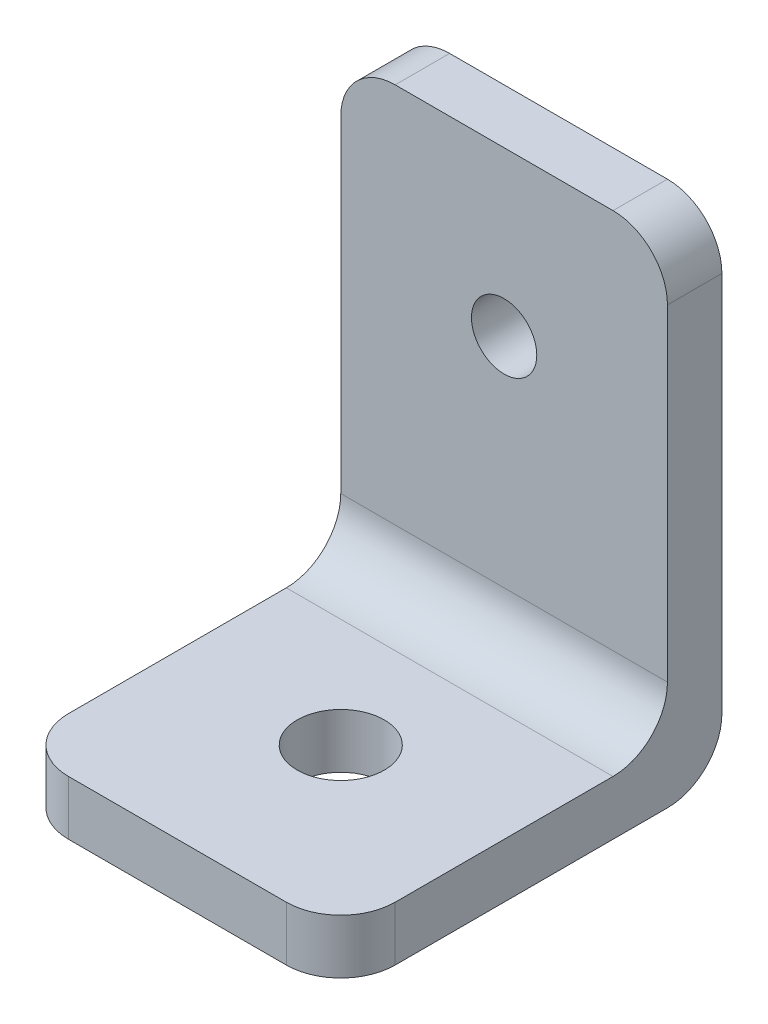
ISO-10303-21;
HEADER;
FILE_DESCRIPTION(('STEP AP214'),'2;1');
FILE_NAME('part.step','',(''),(''),'','','');
FILE_SCHEMA(('AUTOMOTIVE_DESIGN { 1 0 10303 214 1 1 1 1 }'));
ENDSEC;
DATA;
#1=APPLICATION_CONTEXT('core data for automotive mechanical design processes');
#2=APPLICATION_PROTOCOL_DEFINITION('international standard','automotive_design',2000,#1);
#3=PRODUCT_CONTEXT('',#1,'mechanical');
#4=PRODUCT('Part','Part','',(#3));
#5=PRODUCT_RELATED_PRODUCT_CATEGORY('part','',(#4));
#6=PRODUCT_DEFINITION_FORMATION('','',#4);
#7=PRODUCT_DEFINITION_CONTEXT('part definition',#1,'design');
#8=PRODUCT_DEFINITION('design','',#6,#7);
#9=PRODUCT_DEFINITION_SHAPE('','',#8);
#10=(LENGTH_UNIT() NAMED_UNIT(*) SI_UNIT(.MILLI.,.METRE.));
#11=(NAMED_UNIT(*) PLANE_ANGLE_UNIT() SI_UNIT($,.RADIAN.));
#12=(NAMED_UNIT(*) SI_UNIT($,.STERADIAN.) SOLID_ANGLE_UNIT());
#13=UNCERTAINTY_MEASURE_WITH_UNIT(LENGTH_MEASURE(1.E-05),#10,'distance_accuracy_value','');
#14=(GEOMETRIC_REPRESENTATION_CONTEXT(3) GLOBAL_UNCERTAINTY_ASSIGNED_CONTEXT((#13)) GLOBAL_UNIT_ASSIGNED_CONTEXT((#10,
#11,#12)) REPRESENTATION_CONTEXT('',''));
#15=CARTESIAN_POINT('',(0.,0.,0.));
#16=DIRECTION('',(0.,0.,1.));
#17=DIRECTION('',(1.,0.,0.));
#18=AXIS2_PLACEMENT_3D('',#15,#16,#17);
#19=CARTESIAN_POINT('',(0.,0.,5.));
#20=DIRECTION('',(0.,0.,-1.));
#21=DIRECTION('',(-1.,0.,0.));
#22=AXIS2_PLACEMENT_3D('',#19,#20,#21);
#23=PLANE('',#22);
#24=CARTESIAN_POINT('',(15.,30.,5.));
#25=DIRECTION('',(0.,0.,1.));
#26=DIRECTION('',(1.,0.,0.));
#27=AXIS2_PLACEMENT_3D('',#24,#25,#26);
#28=CIRCLE('',#27,3.);
#29=CARTESIAN_POINT('',(18.,30.,5.));
#30=VERTEX_POINT('',#29);
#31=EDGE_CURVE('E254',#30,#30,#28,.T.);
#32=ORIENTED_EDGE('',*,*,#31,.F.);
#33=EDGE_LOOP('',(#32));
#34=FACE_BOUND('',#33,.T.);
#35=DIRECTION('',(0.,-1.,0.));
#36=VECTOR('',#35,1.);
#37=CARTESIAN_POINT('',(0.,0.,5.));
#38=LINE('',#37,#36);
#39=CARTESIAN_POINT('',(0.,40.,5.));
#40=VERTEX_POINT('',#39);
#41=CARTESIAN_POINT('',(0.,10.,5.));
#42=VERTEX_POINT('',#41);
#43=EDGE_CURVE('E229',#40,#42,#38,.T.);
#44=ORIENTED_EDGE('',*,*,#43,.T.);
#45=DIRECTION('',(-1.,0.,0.));
#46=VECTOR('',#45,1.);
#47=CARTESIAN_POINT('',(30.,10.,5.));
#48=LINE('',#47,#46);
#49=CARTESIAN_POINT('',(30.,10.,5.));
#50=VERTEX_POINT('',#49);
#51=EDGE_CURVE('E181',#42,#50,#48,.F.);
#52=ORIENTED_EDGE('',*,*,#51,.T.);
#53=DIRECTION('',(0.,1.,0.));
#54=VECTOR('',#53,1.);
#55=CARTESIAN_POINT('',(30.,45.,5.));
#56=LINE('',#55,#54);
#57=CARTESIAN_POINT('',(30.,40.,5.));
#58=VERTEX_POINT('',#57);
#59=EDGE_CURVE('E248',#50,#58,#56,.T.);
#60=ORIENTED_EDGE('',*,*,#59,.T.);
#61=CARTESIAN_POINT('',(25.,40.,5.));
#62=DIRECTION('',(0.,0.,-1.));
#63=DIRECTION('',(-1.,0.,0.));
#64=AXIS2_PLACEMENT_3D('',#61,#62,#63);
#65=CIRCLE('',#64,5.);
#66=CARTESIAN_POINT('',(25.,45.,5.));
#67=VERTEX_POINT('',#66);
#68=EDGE_CURVE('E170',#58,#67,#65,.F.);
#69=ORIENTED_EDGE('',*,*,#68,.T.);
#70=DIRECTION('',(-1.,0.,0.));
#71=VECTOR('',#70,1.);
#72=CARTESIAN_POINT('',(0.,45.,5.));
#73=LINE('',#72,#71);
#74=CARTESIAN_POINT('',(5.,45.,5.));
#75=VERTEX_POINT('',#74);
#76=EDGE_CURVE('E239',#67,#75,#73,.T.);
#77=ORIENTED_EDGE('',*,*,#76,.T.);
#78=CARTESIAN_POINT('',(5.,40.,5.));
#79=DIRECTION('',(0.,0.,-1.));
#80=DIRECTION('',(-1.,0.,0.));
#81=AXIS2_PLACEMENT_3D('',#78,#79,#80);
#82=CIRCLE('',#81,5.);
#83=EDGE_CURVE('E178',#75,#40,#82,.F.);
#84=ORIENTED_EDGE('',*,*,#83,.T.);
#85=EDGE_LOOP('',(#44,#52,#60,#69,#77,#84));
#86=FACE_BOUND('',#85,.T.);
#87=ADVANCED_FACE('F43',(#34,#86),#23,.F.);
#88=CARTESIAN_POINT('',(0.,0.,0.));
#89=DIRECTION('',(0.,0.,-1.));
#90=DIRECTION('',(-1.,0.,0.));
#91=AXIS2_PLACEMENT_3D('',#88,#89,#90);
#92=PLANE('',#91);
#93=DIRECTION('',(0.,1.,0.));
#94=VECTOR('',#93,1.);
#95=CARTESIAN_POINT('',(30.,45.,0.));
#96=LINE('',#95,#94);
#97=CARTESIAN_POINT('',(30.,5.00000000000001,0.));
#98=VERTEX_POINT('',#97);
#99=CARTESIAN_POINT('',(30.,40.,0.));
#100=VERTEX_POINT('',#99);
#101=EDGE_CURVE('E260',#98,#100,#96,.T.);
#102=ORIENTED_EDGE('',*,*,#101,.F.);
#103=DIRECTION('',(1.,0.,0.));
#104=VECTOR('',#103,1.);
#105=CARTESIAN_POINT('',(0.,5.,0.));
#106=LINE('',#105,#104);
#107=CARTESIAN_POINT('',(0.,5.,0.));
#108=VERTEX_POINT('',#107);
#109=EDGE_CURVE('E207',#98,#108,#106,.F.);
#110=ORIENTED_EDGE('',*,*,#109,.T.);
#111=DIRECTION('',(0.,-1.,0.));
#112=VECTOR('',#111,1.);
#113=CARTESIAN_POINT('',(0.,0.,0.));
#114=LINE('',#113,#112);
#115=CARTESIAN_POINT('',(0.,40.,0.));
#116=VERTEX_POINT('',#115);
#117=EDGE_CURVE('E264',#116,#108,#114,.T.);
#118=ORIENTED_EDGE('',*,*,#117,.F.);
#119=CARTESIAN_POINT('',(5.,40.,0.));
#120=DIRECTION('',(0.,0.,-1.));
#121=DIRECTION('',(-1.,0.,0.));
#122=AXIS2_PLACEMENT_3D('',#119,#120,#121);
#123=CIRCLE('',#122,5.);
#124=CARTESIAN_POINT('',(5.,45.,0.));
#125=VERTEX_POINT('',#124);
#126=EDGE_CURVE('E59',#116,#125,#123,.T.);
#127=ORIENTED_EDGE('',*,*,#126,.T.);
#128=DIRECTION('',(-1.,0.,0.));
#129=VECTOR('',#128,1.);
#130=CARTESIAN_POINT('',(0.,45.,0.));
#131=LINE('',#130,#129);
#132=CARTESIAN_POINT('',(25.,45.,0.));
#133=VERTEX_POINT('',#132);
#134=EDGE_CURVE('E270',#133,#125,#131,.T.);
#135=ORIENTED_EDGE('',*,*,#134,.F.);
#136=CARTESIAN_POINT('',(25.,40.,0.));
#137=DIRECTION('',(0.,0.,-1.));
#138=DIRECTION('',(-1.,0.,0.));
#139=AXIS2_PLACEMENT_3D('',#136,#137,#138);
#140=CIRCLE('',#139,5.);
#141=EDGE_CURVE('E67',#133,#100,#140,.T.);
#142=ORIENTED_EDGE('',*,*,#141,.T.);
#143=EDGE_LOOP('',(#102,#110,#118,#127,#135,#142));
#144=FACE_BOUND('',#143,.T.);
#145=CARTESIAN_POINT('',(15.,30.,0.));
#146=DIRECTION('',(0.,0.,1.));
#147=DIRECTION('',(1.,0.,0.));
#148=AXIS2_PLACEMENT_3D('',#145,#146,#147);
#149=CIRCLE('',#148,3.);
#150=CARTESIAN_POINT('',(18.,30.,0.));
#151=VERTEX_POINT('',#150);
#152=EDGE_CURVE('E250',#151,#151,#149,.T.);
#153=ORIENTED_EDGE('',*,*,#152,.T.);
#154=EDGE_LOOP('',(#153));
#155=FACE_BOUND('',#154,.T.);
#156=ADVANCED_FACE('F318',(#144,#155),#92,.T.);
#157=CARTESIAN_POINT('',(30.,0.,5.));
#158=DIRECTION('',(0.,1.,0.));
#159=DIRECTION('',(0.,0.,1.));
#160=AXIS2_PLACEMENT_3D('',#157,#158,#159);
#161=PLANE('',#160);
#162=CARTESIAN_POINT('',(15.,0.,20.));
#163=DIRECTION('',(0.,1.,0.));
#164=DIRECTION('',(0.,0.,1.));
#165=AXIS2_PLACEMENT_3D('',#162,#163,#164);
#166=CIRCLE('',#165,4.);
#167=CARTESIAN_POINT('',(15.,0.,24.));
#168=VERTEX_POINT('',#167);
#169=EDGE_CURVE('E293',#168,#168,#166,.T.);
#170=ORIENTED_EDGE('',*,*,#169,.T.);
#171=EDGE_LOOP('',(#170));
#172=FACE_BOUND('',#171,.T.);
#173=DIRECTION('',(0.,0.,-1.));
#174=VECTOR('',#173,1.);
#175=CARTESIAN_POINT('',(0.,0.,5.));
#176=LINE('',#175,#174);
#177=CARTESIAN_POINT('',(0.,0.,30.));
#178=VERTEX_POINT('',#177);
#179=CARTESIAN_POINT('',(0.,0.,5.));
#180=VERTEX_POINT('',#179);
#181=EDGE_CURVE('E141',#178,#180,#176,.T.);
#182=ORIENTED_EDGE('',*,*,#181,.T.);
#183=DIRECTION('',(1.,0.,0.));
#184=VECTOR('',#183,1.);
#185=CARTESIAN_POINT('',(30.,0.,5.));
#186=LINE('',#185,#184);
#187=CARTESIAN_POINT('',(30.,0.,5.));
#188=VERTEX_POINT('',#187);
#189=EDGE_CURVE('E190',#180,#188,#186,.T.);
#190=ORIENTED_EDGE('',*,*,#189,.T.);
#191=DIRECTION('',(0.,0.,-1.));
#192=VECTOR('',#191,1.);
#193=CARTESIAN_POINT('',(30.,0.,5.));
#194=LINE('',#193,#192);
#195=CARTESIAN_POINT('',(30.,0.,30.));
#196=VERTEX_POINT('',#195);
#197=EDGE_CURVE('E172',#196,#188,#194,.T.);
#198=ORIENTED_EDGE('',*,*,#197,.F.);
#199=CARTESIAN_POINT('',(25.,0.,30.));
#200=DIRECTION('',(0.,1.,0.));
#201=DIRECTION('',(0.,0.,1.));
#202=AXIS2_PLACEMENT_3D('',#199,#200,#201);
#203=CIRCLE('',#202,5.);
#204=CARTESIAN_POINT('',(25.,0.,35.));
#205=VERTEX_POINT('',#204);
#206=EDGE_CURVE('E184',#196,#205,#203,.F.);
#207=ORIENTED_EDGE('',*,*,#206,.T.);
#208=DIRECTION('',(1.,0.,0.));
#209=VECTOR('',#208,1.);
#210=CARTESIAN_POINT('',(0.,0.,35.));
#211=LINE('',#210,#209);
#212=CARTESIAN_POINT('',(5.,0.,35.));
#213=VERTEX_POINT('',#212);
#214=EDGE_CURVE('E290',#213,#205,#211,.T.);
#215=ORIENTED_EDGE('',*,*,#214,.F.);
#216=CARTESIAN_POINT('',(5.,0.,30.));
#217=DIRECTION('',(0.,1.,0.));
#218=DIRECTION('',(0.,0.,1.));
#219=AXIS2_PLACEMENT_3D('',#216,#217,#218);
#220=CIRCLE('',#219,5.);
#221=EDGE_CURVE('E187',#213,#178,#220,.F.);
#222=ORIENTED_EDGE('',*,*,#221,.T.);
#223=EDGE_LOOP('',(#182,#190,#198,#207,#215,#222));
#224=FACE_BOUND('',#223,.T.);
#225=ADVANCED_FACE('F281',(#172,#224),#161,.F.);
#226=CARTESIAN_POINT('',(30.,45.,5.));
#227=DIRECTION('',(-1.,0.,0.));
#228=DIRECTION('',(0.,0.,1.));
#229=AXIS2_PLACEMENT_3D('',#226,#227,#228);
#230=PLANE('',#229);
#231=ORIENTED_EDGE('',*,*,#197,.T.);
#232=CARTESIAN_POINT('',(30.,5.,5.));
#233=DIRECTION('',(-1.,0.,0.));
#234=DIRECTION('',(0.,0.,1.));
#235=AXIS2_PLACEMENT_3D('',#232,#233,#234);
#236=CIRCLE('',#235,5.);
#237=EDGE_CURVE('E200',#188,#98,#236,.F.);
#238=ORIENTED_EDGE('',*,*,#237,.T.);
#239=ORIENTED_EDGE('',*,*,#101,.T.);
#240=DIRECTION('',(0.,0.,-1.));
#241=VECTOR('',#240,1.);
#242=CARTESIAN_POINT('',(30.,40.,5.));
#243=LINE('',#242,#241);
#244=EDGE_CURVE('E194',#100,#58,#243,.F.);
#245=ORIENTED_EDGE('',*,*,#244,.T.);
#246=ORIENTED_EDGE('',*,*,#59,.F.);
#247=CARTESIAN_POINT('',(30.,10.,10.));
#248=DIRECTION('',(-1.,0.,0.));
#249=DIRECTION('',(0.,0.,1.));
#250=AXIS2_PLACEMENT_3D('',#247,#248,#249);
#251=CIRCLE('',#250,5.);
#252=CARTESIAN_POINT('',(30.,5.,10.));
#253=VERTEX_POINT('',#252);
#254=EDGE_CURVE('E11',#50,#253,#251,.T.);
#255=ORIENTED_EDGE('',*,*,#254,.T.);
#256=DIRECTION('',(0.,0.,-1.));
#257=VECTOR('',#256,1.);
#258=CARTESIAN_POINT('',(30.,5.,35.));
#259=LINE('',#258,#257);
#260=CARTESIAN_POINT('',(30.,5.,30.));
#261=VERTEX_POINT('',#260);
#262=EDGE_CURVE('E158',#261,#253,#259,.T.);
#263=ORIENTED_EDGE('',*,*,#262,.F.);
#264=DIRECTION('',(0.,1.,0.));
#265=VECTOR('',#264,1.);
#266=CARTESIAN_POINT('',(30.,45.,30.));
#267=LINE('',#266,#265);
#268=EDGE_CURVE('E197',#261,#196,#267,.F.);
#269=ORIENTED_EDGE('',*,*,#268,.T.);
#270=EDGE_LOOP('',(#231,#238,#239,#245,#246,#255,#263,#269));
#271=FACE_BOUND('',#270,.T.);
#272=ADVANCED_FACE('F246',(#271),#230,.F.);
#273=CARTESIAN_POINT('',(0.,45.,5.));
#274=DIRECTION('',(0.,-1.,0.));
#275=DIRECTION('',(0.,0.,-1.));
#276=AXIS2_PLACEMENT_3D('',#273,#274,#275);
#277=PLANE('',#276);
#278=ORIENTED_EDGE('',*,*,#134,.T.);
#279=DIRECTION('',(0.,0.,-1.));
#280=VECTOR('',#279,1.);
#281=CARTESIAN_POINT('',(5.,45.,5.));
#282=LINE('',#281,#280);
#283=EDGE_CURVE('E224',#125,#75,#282,.F.);
#284=ORIENTED_EDGE('',*,*,#283,.T.);
#285=ORIENTED_EDGE('',*,*,#76,.F.);
#286=DIRECTION('',(0.,0.,-1.));
#287=VECTOR('',#286,1.);
#288=CARTESIAN_POINT('',(25.,45.,5.));
#289=LINE('',#288,#287);
#290=EDGE_CURVE('E221',#67,#133,#289,.T.);
#291=ORIENTED_EDGE('',*,*,#290,.T.);
#292=EDGE_LOOP('',(#278,#284,#285,#291));
#293=FACE_BOUND('',#292,.T.);
#294=ADVANCED_FACE('F329',(#293),#277,.F.);
#295=CARTESIAN_POINT('',(0.,0.,5.));
#296=DIRECTION('',(1.,0.,0.));
#297=DIRECTION('',(0.,0.,-1.));
#298=AXIS2_PLACEMENT_3D('',#295,#296,#297);
#299=PLANE('',#298);
#300=ORIENTED_EDGE('',*,*,#117,.T.);
#301=CARTESIAN_POINT('',(0.,5.,5.));
#302=DIRECTION('',(1.,0.,0.));
#303=DIRECTION('',(0.,0.,-1.));
#304=AXIS2_PLACEMENT_3D('',#301,#302,#303);
#305=CIRCLE('',#304,5.);
#306=EDGE_CURVE('E145',#108,#180,#305,.F.);
#307=ORIENTED_EDGE('',*,*,#306,.T.);
#308=ORIENTED_EDGE('',*,*,#181,.F.);
#309=DIRECTION('',(0.,-1.,0.));
#310=VECTOR('',#309,1.);
#311=CARTESIAN_POINT('',(0.,0.,30.));
#312=LINE('',#311,#310);
#313=CARTESIAN_POINT('',(0.,5.,30.));
#314=VERTEX_POINT('',#313);
#315=EDGE_CURVE('E135',#178,#314,#312,.F.);
#316=ORIENTED_EDGE('',*,*,#315,.T.);
#317=DIRECTION('',(0.,0.,-1.));
#318=VECTOR('',#317,1.);
#319=CARTESIAN_POINT('',(0.,5.,35.));
#320=LINE('',#319,#318);
#321=CARTESIAN_POINT('',(0.,5.,10.));
#322=VERTEX_POINT('',#321);
#323=EDGE_CURVE('E139',#314,#322,#320,.T.);
#324=ORIENTED_EDGE('',*,*,#323,.T.);
#325=CARTESIAN_POINT('',(0.,10.,10.));
#326=DIRECTION('',(1.,0.,0.));
#327=DIRECTION('',(0.,0.,-1.));
#328=AXIS2_PLACEMENT_3D('',#325,#326,#327);
#329=CIRCLE('',#328,5.);
#330=EDGE_CURVE('E52',#322,#42,#329,.T.);
#331=ORIENTED_EDGE('',*,*,#330,.T.);
#332=ORIENTED_EDGE('',*,*,#43,.F.);
#333=DIRECTION('',(0.,0.,-1.));
#334=VECTOR('',#333,1.);
#335=CARTESIAN_POINT('',(0.,40.,5.));
#336=LINE('',#335,#334);
#337=EDGE_CURVE('E146',#40,#116,#336,.T.);
#338=ORIENTED_EDGE('',*,*,#337,.T.);
#339=EDGE_LOOP('',(#300,#307,#308,#316,#324,#331,#332,#338));
#340=FACE_BOUND('',#339,.T.);
#341=ADVANCED_FACE('F138',(#340),#299,.F.);
#342=CARTESIAN_POINT('',(15.,30.,5.));
#343=DIRECTION('',(0.,0.,-1.));
#344=DIRECTION('',(-1.,0.,0.));
#345=AXIS2_PLACEMENT_3D('',#342,#343,#344);
#346=CYLINDRICAL_SURFACE('',#345,3.);
#347=ORIENTED_EDGE('',*,*,#31,.T.);
#348=EDGE_LOOP('',(#347));
#349=FACE_BOUND('',#348,.T.);
#350=ORIENTED_EDGE('',*,*,#152,.F.);
#351=EDGE_LOOP('',(#350));
#352=FACE_BOUND('',#351,.T.);
#353=ADVANCED_FACE('F308',(#349,#352),#346,.F.);
#354=CARTESIAN_POINT('',(0.,5.,35.));
#355=DIRECTION('',(0.,-1.,0.));
#356=DIRECTION('',(0.,0.,-1.));
#357=AXIS2_PLACEMENT_3D('',#354,#355,#356);
#358=PLANE('',#357);
#359=CARTESIAN_POINT('',(15.,5.,20.));
#360=DIRECTION('',(0.,1.,0.));
#361=DIRECTION('',(0.,0.,1.));
#362=AXIS2_PLACEMENT_3D('',#359,#360,#361);
#363=CIRCLE('',#362,4.);
#364=CARTESIAN_POINT('',(15.,5.,24.));
#365=VERTEX_POINT('',#364);
#366=EDGE_CURVE('E299',#365,#365,#363,.T.);
#367=ORIENTED_EDGE('',*,*,#366,.F.);
#368=EDGE_LOOP('',(#367));
#369=FACE_BOUND('',#368,.T.);
#370=ORIENTED_EDGE('',*,*,#262,.T.);
#371=DIRECTION('',(-1.,0.,0.));
#372=VECTOR('',#371,1.);
#373=CARTESIAN_POINT('',(0.,5.,10.));
#374=LINE('',#373,#372);
#375=EDGE_CURVE('E156',#253,#322,#374,.T.);
#376=ORIENTED_EDGE('',*,*,#375,.T.);
#377=ORIENTED_EDGE('',*,*,#323,.F.);
#378=CARTESIAN_POINT('',(5.,5.,30.));
#379=DIRECTION('',(0.,-1.,0.));
#380=DIRECTION('',(0.,0.,-1.));
#381=AXIS2_PLACEMENT_3D('',#378,#379,#380);
#382=CIRCLE('',#381,5.);
#383=CARTESIAN_POINT('',(5.,5.,35.));
#384=VERTEX_POINT('',#383);
#385=EDGE_CURVE('E153',#314,#384,#382,.F.);
#386=ORIENTED_EDGE('',*,*,#385,.T.);
#387=DIRECTION('',(-1.,0.,0.));
#388=VECTOR('',#387,1.);
#389=CARTESIAN_POINT('',(0.,5.,35.));
#390=LINE('',#389,#388);
#391=CARTESIAN_POINT('',(25.,5.,35.));
#392=VERTEX_POINT('',#391);
#393=EDGE_CURVE('E159',#392,#384,#390,.T.);
#394=ORIENTED_EDGE('',*,*,#393,.F.);
#395=CARTESIAN_POINT('',(25.,5.,30.));
#396=DIRECTION('',(0.,-1.,0.));
#397=DIRECTION('',(0.,0.,-1.));
#398=AXIS2_PLACEMENT_3D('',#395,#396,#397);
#399=CIRCLE('',#398,5.);
#400=EDGE_CURVE('E166',#392,#261,#399,.F.);
#401=ORIENTED_EDGE('',*,*,#400,.T.);
#402=EDGE_LOOP('',(#370,#376,#377,#386,#394,#401));
#403=FACE_BOUND('',#402,.T.);
#404=ADVANCED_FACE('F151',(#369,#403),#358,.F.);
#405=CARTESIAN_POINT('',(0.,0.,35.));
#406=DIRECTION('',(0.,0.,-1.));
#407=DIRECTION('',(-1.,0.,0.));
#408=AXIS2_PLACEMENT_3D('',#405,#406,#407);
#409=PLANE('',#408);
#410=ORIENTED_EDGE('',*,*,#393,.T.);
#411=DIRECTION('',(0.,-1.,0.));
#412=VECTOR('',#411,1.);
#413=CARTESIAN_POINT('',(5.,0.,35.));
#414=LINE('',#413,#412);
#415=EDGE_CURVE('E164',#384,#213,#414,.T.);
#416=ORIENTED_EDGE('',*,*,#415,.T.);
#417=ORIENTED_EDGE('',*,*,#214,.T.);
#418=DIRECTION('',(0.,1.,0.));
#419=VECTOR('',#418,1.);
#420=CARTESIAN_POINT('',(25.,0.,35.));
#421=LINE('',#420,#419);
#422=EDGE_CURVE('E215',#205,#392,#421,.T.);
#423=ORIENTED_EDGE('',*,*,#422,.T.);
#424=EDGE_LOOP('',(#410,#416,#417,#423));
#425=FACE_BOUND('',#424,.T.);
#426=ADVANCED_FACE('F289',(#425),#409,.F.);
#427=CARTESIAN_POINT('',(15.,-25.,20.));
#428=DIRECTION('',(0.,1.,0.));
#429=DIRECTION('',(0.,0.,1.));
#430=AXIS2_PLACEMENT_3D('',#427,#428,#429);
#431=CYLINDRICAL_SURFACE('',#430,4.);
#432=ORIENTED_EDGE('',*,*,#366,.T.);
#433=EDGE_LOOP('',(#432));
#434=FACE_BOUND('',#433,.T.);
#435=ORIENTED_EDGE('',*,*,#169,.F.);
#436=EDGE_LOOP('',(#435));
#437=FACE_BOUND('',#436,.T.);
#438=ADVANCED_FACE('F304',(#434,#437),#431,.F.);
#439=CARTESIAN_POINT('',(0.,10.,10.));
#440=DIRECTION('',(1.,0.,0.));
#441=DIRECTION('',(0.,0.,-1.));
#442=AXIS2_PLACEMENT_3D('',#439,#440,#441);
#443=CYLINDRICAL_SURFACE('',#442,5.);
#444=ORIENTED_EDGE('',*,*,#254,.F.);
#445=ORIENTED_EDGE('',*,*,#51,.F.);
#446=ORIENTED_EDGE('',*,*,#330,.F.);
#447=ORIENTED_EDGE('',*,*,#375,.F.);
#448=EDGE_LOOP('',(#444,#445,#446,#447));
#449=FACE_BOUND('',#448,.T.);
#450=ADVANCED_FACE('F242',(#449),#443,.F.);
#451=CARTESIAN_POINT('',(30.,5.,5.));
#452=DIRECTION('',(-1.,0.,0.));
#453=DIRECTION('',(0.,0.,1.));
#454=AXIS2_PLACEMENT_3D('',#451,#452,#453);
#455=CYLINDRICAL_SURFACE('',#454,5.);
#456=ORIENTED_EDGE('',*,*,#306,.F.);
#457=ORIENTED_EDGE('',*,*,#109,.F.);
#458=ORIENTED_EDGE('',*,*,#237,.F.);
#459=ORIENTED_EDGE('',*,*,#189,.F.);
#460=EDGE_LOOP('',(#456,#457,#458,#459));
#461=FACE_BOUND('',#460,.T.);
#462=ADVANCED_FACE('F340',(#461),#455,.T.);
#463=CARTESIAN_POINT('',(5.,0.,30.));
#464=DIRECTION('',(0.,-1.,0.));
#465=DIRECTION('',(0.,0.,-1.));
#466=AXIS2_PLACEMENT_3D('',#463,#464,#465);
#467=CYLINDRICAL_SURFACE('',#466,5.);
#468=ORIENTED_EDGE('',*,*,#385,.F.);
#469=ORIENTED_EDGE('',*,*,#315,.F.);
#470=ORIENTED_EDGE('',*,*,#221,.F.);
#471=ORIENTED_EDGE('',*,*,#415,.F.);
#472=EDGE_LOOP('',(#468,#469,#470,#471));
#473=FACE_BOUND('',#472,.T.);
#474=ADVANCED_FACE('F162',(#473),#467,.T.);
#475=CARTESIAN_POINT('',(25.,0.,30.));
#476=DIRECTION('',(0.,1.,0.));
#477=DIRECTION('',(0.,0.,1.));
#478=AXIS2_PLACEMENT_3D('',#475,#476,#477);
#479=CYLINDRICAL_SURFACE('',#478,5.);
#480=ORIENTED_EDGE('',*,*,#206,.F.);
#481=ORIENTED_EDGE('',*,*,#268,.F.);
#482=ORIENTED_EDGE('',*,*,#400,.F.);
#483=ORIENTED_EDGE('',*,*,#422,.F.);
#484=EDGE_LOOP('',(#480,#481,#482,#483));
#485=FACE_BOUND('',#484,.T.);
#486=ADVANCED_FACE('F287',(#485),#479,.T.);
#487=CARTESIAN_POINT('',(5.,40.,5.));
#488=DIRECTION('',(0.,0.,-1.));
#489=DIRECTION('',(-1.,0.,0.));
#490=AXIS2_PLACEMENT_3D('',#487,#488,#489);
#491=CYLINDRICAL_SURFACE('',#490,5.);
#492=ORIENTED_EDGE('',*,*,#83,.F.);
#493=ORIENTED_EDGE('',*,*,#283,.F.);
#494=ORIENTED_EDGE('',*,*,#126,.F.);
#495=ORIENTED_EDGE('',*,*,#337,.F.);
#496=EDGE_LOOP('',(#492,#493,#494,#495));
#497=FACE_BOUND('',#496,.T.);
#498=ADVANCED_FACE('F347',(#497),#491,.T.);
#499=CARTESIAN_POINT('',(25.,40.,5.));
#500=DIRECTION('',(0.,0.,-1.));
#501=DIRECTION('',(-1.,0.,0.));
#502=AXIS2_PLACEMENT_3D('',#499,#500,#501);
#503=CYLINDRICAL_SURFACE('',#502,5.);
#504=ORIENTED_EDGE('',*,*,#68,.F.);
#505=ORIENTED_EDGE('',*,*,#244,.F.);
#506=ORIENTED_EDGE('',*,*,#141,.F.);
#507=ORIENTED_EDGE('',*,*,#290,.F.);
#508=EDGE_LOOP('',(#504,#505,#506,#507));
#509=FACE_BOUND('',#508,.T.);
#510=ADVANCED_FACE('F45',(#509),#503,.T.);
#511=CLOSED_SHELL('',(#87,#156,#225,#272,#294,#341,#353,#404,#426,#438,#450,#462,#474,#486,#498,#510));
#512=MANIFOLD_SOLID_BREP('B2',#511);
#513=ADVANCED_BREP_SHAPE_REPRESENTATION('',(#18,#512),#14);
#514=SHAPE_DEFINITION_REPRESENTATION(#9,#513);
ENDSEC;
END-ISO-10303-21;
